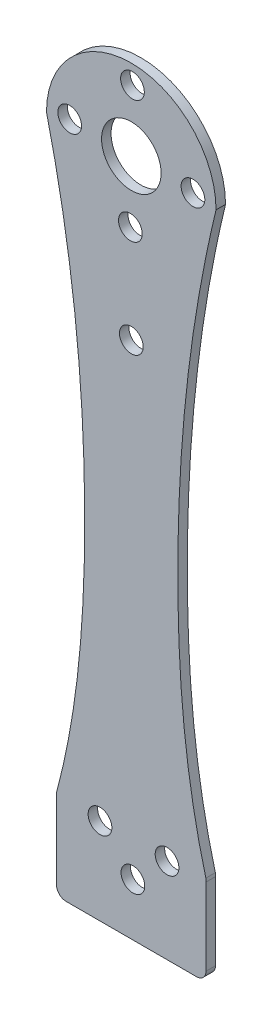
ISO-10303-21;
HEADER;
FILE_DESCRIPTION(('STEP AP214'),'2;1');
FILE_NAME('part.step','',(''),(''),'','','');
FILE_SCHEMA(('AUTOMOTIVE_DESIGN { 1 0 10303 214 1 1 1 1 }'));
ENDSEC;
DATA;
#1=APPLICATION_CONTEXT('core data for automotive mechanical design processes');
#2=APPLICATION_PROTOCOL_DEFINITION('international standard','automotive_design',2000,#1);
#3=PRODUCT_CONTEXT('',#1,'mechanical');
#4=PRODUCT('Part','Part','',(#3));
#5=PRODUCT_RELATED_PRODUCT_CATEGORY('part','',(#4));
#6=PRODUCT_DEFINITION_FORMATION('','',#4);
#7=PRODUCT_DEFINITION_CONTEXT('part definition',#1,'design');
#8=PRODUCT_DEFINITION('design','',#6,#7);
#9=PRODUCT_DEFINITION_SHAPE('','',#8);
#10=(LENGTH_UNIT() NAMED_UNIT(*) SI_UNIT(.MILLI.,.METRE.));
#11=(NAMED_UNIT(*) PLANE_ANGLE_UNIT() SI_UNIT($,.RADIAN.));
#12=(NAMED_UNIT(*) SI_UNIT($,.STERADIAN.) SOLID_ANGLE_UNIT());
#13=UNCERTAINTY_MEASURE_WITH_UNIT(LENGTH_MEASURE(1.E-05),#10,'distance_accuracy_value','');
#14=(GEOMETRIC_REPRESENTATION_CONTEXT(3) GLOBAL_UNCERTAINTY_ASSIGNED_CONTEXT((#13)) GLOBAL_UNIT_ASSIGNED_CONTEXT((#10,
#11,#12)) REPRESENTATION_CONTEXT('',''));
#15=CARTESIAN_POINT('',(0.,0.,0.));
#16=DIRECTION('',(0.,0.,1.));
#17=DIRECTION('',(1.,0.,0.));
#18=AXIS2_PLACEMENT_3D('',#15,#16,#17);
#19=CARTESIAN_POINT('',(-11.3538,84.2645,1.27));
#20=CARTESIAN_POINT('',(-7.71799886799077,69.2244592815278,1.27));
#21=CARTESIAN_POINT('',(-5.0515191185931,42.938826991451,1.27));
#22=CARTESIAN_POINT('',(-7.16781758354668,16.591535459439,1.27));
#23=CARTESIAN_POINT('',(-9.99076973307465,6.0846032391333,1.27));
#24=B_SPLINE_CURVE_WITH_KNOTS('',3,(#19,#20,#21,#22,#23),.UNSPECIFIED.,.F.,.F.,(4,1,4),(0.,
0.587531518822858,1.),.UNSPECIFIED.);
#25=DIRECTION('',(0.,0.,-1.));
#26=VECTOR('',#25,1.);
#27=SURFACE_OF_LINEAR_EXTRUSION('',#24,#26);
#28=CARTESIAN_POINT('',(-11.3538,84.2645,0.));
#29=CARTESIAN_POINT('',(-7.71799886799077,69.2244592815278,0.));
#30=CARTESIAN_POINT('',(-5.0515191185931,42.938826991451,0.));
#31=CARTESIAN_POINT('',(-7.16781758354668,16.591535459439,0.));
#32=CARTESIAN_POINT('',(-9.99076973307465,6.0846032391333,0.));
#33=B_SPLINE_CURVE_WITH_KNOTS('',3,(#28,#29,#30,#31,#32),.UNSPECIFIED.,.F.,.F.,(4,1,4),(0.,
0.587531518822858,1.),.UNSPECIFIED.);
#34=CARTESIAN_POINT('',(-11.3538,84.2645,0.));
#35=VERTEX_POINT('',#34);
#36=CARTESIAN_POINT('',(-9.99076973307465,6.0846032391333,0.));
#37=VERTEX_POINT('',#36);
#38=EDGE_CURVE('E190',#35,#37,#33,.T.);
#39=ORIENTED_EDGE('',*,*,#38,.T.);
#40=DIRECTION('',(0.,0.,-1.));
#41=VECTOR('',#40,1.);
#42=CARTESIAN_POINT('',(-9.99076973307465,6.0846032391333,1.27));
#43=LINE('',#42,#41);
#44=CARTESIAN_POINT('',(-9.99076973307465,6.0846032391333,1.27));
#45=VERTEX_POINT('',#44);
#46=EDGE_CURVE('E11',#45,#37,#43,.T.);
#47=ORIENTED_EDGE('',*,*,#46,.F.);
#48=CARTESIAN_POINT('',(-11.3538,84.2645,1.27));
#49=VERTEX_POINT('',#48);
#50=EDGE_CURVE('E217',#49,#45,#24,.T.);
#51=ORIENTED_EDGE('',*,*,#50,.F.);
#52=DIRECTION('',(0.,0.,-1.));
#53=VECTOR('',#52,1.);
#54=CARTESIAN_POINT('',(-11.3538,84.2645,1.27));
#55=LINE('',#54,#53);
#56=EDGE_CURVE('E138',#49,#35,#55,.T.);
#57=ORIENTED_EDGE('',*,*,#56,.T.);
#58=EDGE_LOOP('',(#39,#47,#51,#57));
#59=FACE_BOUND('',#58,.T.);
#60=ADVANCED_FACE('F33',(#59),#27,.F.);
#61=CARTESIAN_POINT('',(-3.6576,5.622584698307,1.27));
#62=DIRECTION('',(0.,0.,-1.));
#63=DIRECTION('',(-1.,0.,0.));
#64=AXIS2_PLACEMENT_3D('',#61,#62,#63);
#65=CYLINDRICAL_SURFACE('',#64,6.35);
#66=CARTESIAN_POINT('',(-3.6576,5.622584698307,0.));
#67=DIRECTION('',(0.,0.,1.));
#68=DIRECTION('',(1.,0.,0.));
#69=AXIS2_PLACEMENT_3D('',#66,#67,#68);
#70=CIRCLE('',#69,6.35);
#71=CARTESIAN_POINT('',(-10.0076,5.622584698307,0.));
#72=VERTEX_POINT('',#71);
#73=EDGE_CURVE('E181',#37,#72,#70,.T.);
#74=ORIENTED_EDGE('',*,*,#73,.T.);
#75=DIRECTION('',(0.,0.,-1.));
#76=VECTOR('',#75,1.);
#77=CARTESIAN_POINT('',(-10.0076,5.622584698307,1.27));
#78=LINE('',#77,#76);
#79=CARTESIAN_POINT('',(-10.0076,5.622584698307,1.27));
#80=VERTEX_POINT('',#79);
#81=EDGE_CURVE('E42',#80,#72,#78,.T.);
#82=ORIENTED_EDGE('',*,*,#81,.F.);
#83=CARTESIAN_POINT('',(-3.6576,5.622584698307,1.27));
#84=DIRECTION('',(0.,0.,1.));
#85=DIRECTION('',(1.,0.,0.));
#86=AXIS2_PLACEMENT_3D('',#83,#84,#85);
#87=CIRCLE('',#86,6.35);
#88=EDGE_CURVE('E99',#45,#80,#87,.T.);
#89=ORIENTED_EDGE('',*,*,#88,.F.);
#90=ORIENTED_EDGE('',*,*,#46,.T.);
#91=EDGE_LOOP('',(#74,#82,#89,#90));
#92=FACE_BOUND('',#91,.T.);
#93=ADVANCED_FACE('F174',(#92),#65,.T.);
#94=CARTESIAN_POINT('',(-10.0076,5.622584698307,1.27));
#95=DIRECTION('',(1.,0.,0.));
#96=DIRECTION('',(0.,1.,0.));
#97=AXIS2_PLACEMENT_3D('',#94,#95,#96);
#98=PLANE('',#97);
#99=DIRECTION('',(0.,-1.,0.));
#100=VECTOR('',#99,1.);
#101=CARTESIAN_POINT('',(-10.0076,5.622584698307,0.));
#102=LINE('',#101,#100);
#103=CARTESIAN_POINT('',(-10.0076,-4.71169999999999,0.));
#104=VERTEX_POINT('',#103);
#105=EDGE_CURVE('E189',#72,#104,#102,.T.);
#106=ORIENTED_EDGE('',*,*,#105,.T.);
#107=DIRECTION('',(0.,0.,-1.));
#108=VECTOR('',#107,1.);
#109=CARTESIAN_POINT('',(-10.0076,-4.71169999999999,1.27));
#110=LINE('',#109,#108);
#111=CARTESIAN_POINT('',(-10.0076,-4.71169999999999,1.27));
#112=VERTEX_POINT('',#111);
#113=EDGE_CURVE('E195',#112,#104,#110,.T.);
#114=ORIENTED_EDGE('',*,*,#113,.F.);
#115=DIRECTION('',(0.,-1.,0.));
#116=VECTOR('',#115,1.);
#117=CARTESIAN_POINT('',(-10.0076,5.622584698307,1.27));
#118=LINE('',#117,#116);
#119=EDGE_CURVE('E194',#80,#112,#118,.T.);
#120=ORIENTED_EDGE('',*,*,#119,.F.);
#121=ORIENTED_EDGE('',*,*,#81,.T.);
#122=EDGE_LOOP('',(#106,#114,#120,#121));
#123=FACE_BOUND('',#122,.T.);
#124=ADVANCED_FACE('F171',(#123),#98,.F.);
#125=CARTESIAN_POINT('',(-8.7376,-4.7117,1.27));
#126=DIRECTION('',(0.,0.,-1.));
#127=DIRECTION('',(-1.,0.,0.));
#128=AXIS2_PLACEMENT_3D('',#125,#126,#127);
#129=CYLINDRICAL_SURFACE('',#128,1.27);
#130=CARTESIAN_POINT('',(-8.7376,-4.7117,0.));
#131=DIRECTION('',(0.,0.,1.));
#132=DIRECTION('',(1.,0.,0.));
#133=AXIS2_PLACEMENT_3D('',#130,#131,#132);
#134=CIRCLE('',#133,1.27);
#135=CARTESIAN_POINT('',(-8.73759999999999,-5.9817,0.));
#136=VERTEX_POINT('',#135);
#137=EDGE_CURVE('E199',#104,#136,#134,.T.);
#138=ORIENTED_EDGE('',*,*,#137,.T.);
#139=DIRECTION('',(0.,0.,-1.));
#140=VECTOR('',#139,1.);
#141=CARTESIAN_POINT('',(-8.73759999999999,-5.9817,1.27));
#142=LINE('',#141,#140);
#143=CARTESIAN_POINT('',(-8.73759999999999,-5.9817,1.27));
#144=VERTEX_POINT('',#143);
#145=EDGE_CURVE('E227',#144,#136,#142,.T.);
#146=ORIENTED_EDGE('',*,*,#145,.F.);
#147=CARTESIAN_POINT('',(-8.7376,-4.7117,1.27));
#148=DIRECTION('',(0.,0.,1.));
#149=DIRECTION('',(1.,0.,0.));
#150=AXIS2_PLACEMENT_3D('',#147,#148,#149);
#151=CIRCLE('',#150,1.27);
#152=EDGE_CURVE('E232',#112,#144,#151,.T.);
#153=ORIENTED_EDGE('',*,*,#152,.F.);
#154=ORIENTED_EDGE('',*,*,#113,.T.);
#155=EDGE_LOOP('',(#138,#146,#153,#154));
#156=FACE_BOUND('',#155,.T.);
#157=ADVANCED_FACE('F167',(#156),#129,.T.);
#158=CARTESIAN_POINT('',(8.73759999999999,-5.9817,1.27));
#159=DIRECTION('',(0.,1.,0.));
#160=DIRECTION('',(-1.,0.,0.));
#161=AXIS2_PLACEMENT_3D('',#158,#159,#160);
#162=PLANE('',#161);
#163=DIRECTION('',(1.,0.,0.));
#164=VECTOR('',#163,1.);
#165=CARTESIAN_POINT('',(8.73759999999999,-5.9817,0.));
#166=LINE('',#165,#164);
#167=CARTESIAN_POINT('',(8.73759999999999,-5.9817,0.));
#168=VERTEX_POINT('',#167);
#169=EDGE_CURVE('E201',#136,#168,#166,.T.);
#170=ORIENTED_EDGE('',*,*,#169,.T.);
#171=DIRECTION('',(0.,0.,-1.));
#172=VECTOR('',#171,1.);
#173=CARTESIAN_POINT('',(8.73759999999999,-5.9817,1.27));
#174=LINE('',#173,#172);
#175=CARTESIAN_POINT('',(8.73759999999999,-5.9817,1.27));
#176=VERTEX_POINT('',#175);
#177=EDGE_CURVE('E224',#176,#168,#174,.T.);
#178=ORIENTED_EDGE('',*,*,#177,.F.);
#179=DIRECTION('',(1.,0.,0.));
#180=VECTOR('',#179,1.);
#181=CARTESIAN_POINT('',(8.73759999999999,-5.9817,1.27));
#182=LINE('',#181,#180);
#183=EDGE_CURVE('E234',#144,#176,#182,.T.);
#184=ORIENTED_EDGE('',*,*,#183,.F.);
#185=ORIENTED_EDGE('',*,*,#145,.T.);
#186=EDGE_LOOP('',(#170,#178,#184,#185));
#187=FACE_BOUND('',#186,.T.);
#188=ADVANCED_FACE('F163',(#187),#162,.F.);
#189=CARTESIAN_POINT('',(8.7376,-4.7117,1.27));
#190=DIRECTION('',(0.,0.,-1.));
#191=DIRECTION('',(-1.,0.,0.));
#192=AXIS2_PLACEMENT_3D('',#189,#190,#191);
#193=CYLINDRICAL_SURFACE('',#192,1.27);
#194=CARTESIAN_POINT('',(8.7376,-4.7117,0.));
#195=DIRECTION('',(0.,0.,1.));
#196=DIRECTION('',(-1.,0.,0.));
#197=AXIS2_PLACEMENT_3D('',#194,#195,#196);
#198=CIRCLE('',#197,1.27);
#199=CARTESIAN_POINT('',(10.0076,-4.71169999999999,0.));
#200=VERTEX_POINT('',#199);
#201=EDGE_CURVE('E205',#168,#200,#198,.T.);
#202=ORIENTED_EDGE('',*,*,#201,.T.);
#203=DIRECTION('',(0.,0.,-1.));
#204=VECTOR('',#203,1.);
#205=CARTESIAN_POINT('',(10.0076,-4.71169999999999,1.27));
#206=LINE('',#205,#204);
#207=CARTESIAN_POINT('',(10.0076,-4.71169999999999,1.27));
#208=VERTEX_POINT('',#207);
#209=EDGE_CURVE('E221',#208,#200,#206,.T.);
#210=ORIENTED_EDGE('',*,*,#209,.F.);
#211=CARTESIAN_POINT('',(8.7376,-4.7117,1.27));
#212=DIRECTION('',(0.,0.,1.));
#213=DIRECTION('',(-1.,0.,0.));
#214=AXIS2_PLACEMENT_3D('',#211,#212,#213);
#215=CIRCLE('',#214,1.27);
#216=EDGE_CURVE('E236',#176,#208,#215,.T.);
#217=ORIENTED_EDGE('',*,*,#216,.F.);
#218=ORIENTED_EDGE('',*,*,#177,.T.);
#219=EDGE_LOOP('',(#202,#210,#217,#218));
#220=FACE_BOUND('',#219,.T.);
#221=ADVANCED_FACE('F159',(#220),#193,.T.);
#222=CARTESIAN_POINT('',(10.0076,5.62258469830698,1.27));
#223=DIRECTION('',(-1.,0.,0.));
#224=DIRECTION('',(0.,-1.,0.));
#225=AXIS2_PLACEMENT_3D('',#222,#223,#224);
#226=PLANE('',#225);
#227=DIRECTION('',(0.,1.,0.));
#228=VECTOR('',#227,1.);
#229=CARTESIAN_POINT('',(10.0076,5.62258469830698,0.));
#230=LINE('',#229,#228);
#231=CARTESIAN_POINT('',(10.0076,5.62258469830698,0.));
#232=VERTEX_POINT('',#231);
#233=EDGE_CURVE('E207',#200,#232,#230,.T.);
#234=ORIENTED_EDGE('',*,*,#233,.T.);
#235=DIRECTION('',(0.,0.,-1.));
#236=VECTOR('',#235,1.);
#237=CARTESIAN_POINT('',(10.0076,5.62258469830698,1.27));
#238=LINE('',#237,#236);
#239=CARTESIAN_POINT('',(10.0076,5.62258469830698,1.27));
#240=VERTEX_POINT('',#239);
#241=EDGE_CURVE('E133',#240,#232,#238,.T.);
#242=ORIENTED_EDGE('',*,*,#241,.F.);
#243=DIRECTION('',(0.,1.,0.));
#244=VECTOR('',#243,1.);
#245=CARTESIAN_POINT('',(10.0076,5.62258469830698,1.27));
#246=LINE('',#245,#244);
#247=EDGE_CURVE('E124',#208,#240,#246,.T.);
#248=ORIENTED_EDGE('',*,*,#247,.F.);
#249=ORIENTED_EDGE('',*,*,#209,.T.);
#250=EDGE_LOOP('',(#234,#242,#248,#249));
#251=FACE_BOUND('',#250,.T.);
#252=ADVANCED_FACE('F156',(#251),#226,.F.);
#253=CARTESIAN_POINT('',(3.65760000000001,5.62258469830698,1.27));
#254=DIRECTION('',(0.,0.,-1.));
#255=DIRECTION('',(-1.,0.,0.));
#256=AXIS2_PLACEMENT_3D('',#253,#254,#255);
#257=CYLINDRICAL_SURFACE('',#256,6.35);
#258=CARTESIAN_POINT('',(3.65760000000001,5.62258469830698,0.));
#259=DIRECTION('',(0.,0.,1.));
#260=DIRECTION('',(-1.,0.,0.));
#261=AXIS2_PLACEMENT_3D('',#258,#259,#260);
#262=CIRCLE('',#261,6.35);
#263=CARTESIAN_POINT('',(9.99076973307465,6.08460323913331,0.));
#264=VERTEX_POINT('',#263);
#265=EDGE_CURVE('E132',#232,#264,#262,.T.);
#266=ORIENTED_EDGE('',*,*,#265,.T.);
#267=DIRECTION('',(0.,0.,-1.));
#268=VECTOR('',#267,1.);
#269=CARTESIAN_POINT('',(9.99076973307465,6.08460323913331,1.27));
#270=LINE('',#269,#268);
#271=CARTESIAN_POINT('',(9.99076973307465,6.08460323913331,1.27));
#272=VERTEX_POINT('',#271);
#273=EDGE_CURVE('E129',#272,#264,#270,.T.);
#274=ORIENTED_EDGE('',*,*,#273,.F.);
#275=CARTESIAN_POINT('',(3.65760000000001,5.62258469830698,1.27));
#276=DIRECTION('',(0.,0.,1.));
#277=DIRECTION('',(-1.,0.,0.));
#278=AXIS2_PLACEMENT_3D('',#275,#276,#277);
#279=CIRCLE('',#278,6.35);
#280=EDGE_CURVE('E118',#240,#272,#279,.T.);
#281=ORIENTED_EDGE('',*,*,#280,.F.);
#282=ORIENTED_EDGE('',*,*,#241,.T.);
#283=EDGE_LOOP('',(#266,#274,#281,#282));
#284=FACE_BOUND('',#283,.T.);
#285=ADVANCED_FACE('F130',(#284),#257,.T.);
#286=CARTESIAN_POINT('',(9.99076973307465,6.08460323913331,1.27));
#287=CARTESIAN_POINT('',(7.16781758354668,16.591535459439,1.27));
#288=CARTESIAN_POINT('',(5.0515191185931,42.938826991451,1.27));
#289=CARTESIAN_POINT('',(7.71799886799077,69.2244592815278,1.27));
#290=CARTESIAN_POINT('',(11.3538,84.2645,1.27));
#291=B_SPLINE_CURVE_WITH_KNOTS('',3,(#286,#287,#288,#289,#290),.UNSPECIFIED.,.F.,.F.,(4,1,4),
(0.,0.412468481177142,1.),.UNSPECIFIED.);
#292=DIRECTION('',(0.,0.,-1.));
#293=VECTOR('',#292,1.);
#294=SURFACE_OF_LINEAR_EXTRUSION('',#291,#293);
#295=CARTESIAN_POINT('',(9.99076973307465,6.08460323913331,0.));
#296=CARTESIAN_POINT('',(7.16781758354668,16.591535459439,0.));
#297=CARTESIAN_POINT('',(5.0515191185931,42.938826991451,0.));
#298=CARTESIAN_POINT('',(7.71799886799077,69.2244592815278,0.));
#299=CARTESIAN_POINT('',(11.3538,84.2645,0.));
#300=B_SPLINE_CURVE_WITH_KNOTS('',3,(#295,#296,#297,#298,#299),.UNSPECIFIED.,.F.,.F.,(4,1,4),
(0.,0.412468481177142,1.),.UNSPECIFIED.);
#301=CARTESIAN_POINT('',(11.3538,84.2645,0.));
#302=VERTEX_POINT('',#301);
#303=EDGE_CURVE('E85',#264,#302,#300,.T.);
#304=ORIENTED_EDGE('',*,*,#303,.T.);
#305=DIRECTION('',(0.,0.,-1.));
#306=VECTOR('',#305,1.);
#307=CARTESIAN_POINT('',(11.3538,84.2645,1.27));
#308=LINE('',#307,#306);
#309=CARTESIAN_POINT('',(11.3538,84.2645,1.27));
#310=VERTEX_POINT('',#309);
#311=EDGE_CURVE('E134',#310,#302,#308,.T.);
#312=ORIENTED_EDGE('',*,*,#311,.F.);
#313=EDGE_CURVE('E122',#272,#310,#291,.T.);
#314=ORIENTED_EDGE('',*,*,#313,.F.);
#315=ORIENTED_EDGE('',*,*,#273,.T.);
#316=EDGE_LOOP('',(#304,#312,#314,#315));
#317=FACE_BOUND('',#316,.T.);
#318=ADVANCED_FACE('F136',(#317),#294,.F.);
#319=CARTESIAN_POINT('',(0.,84.2645,1.27));
#320=DIRECTION('',(0.,0.,-1.));
#321=DIRECTION('',(-1.,0.,0.));
#322=AXIS2_PLACEMENT_3D('',#319,#320,#321);
#323=CYLINDRICAL_SURFACE('',#322,11.3538);
#324=CARTESIAN_POINT('',(0.,84.2645,0.));
#325=DIRECTION('',(0.,0.,1.));
#326=DIRECTION('',(1.,0.,0.));
#327=AXIS2_PLACEMENT_3D('',#324,#325,#326);
#328=CIRCLE('',#327,11.3538);
#329=EDGE_CURVE('E91',#302,#35,#328,.T.);
#330=ORIENTED_EDGE('',*,*,#329,.T.);
#331=ORIENTED_EDGE('',*,*,#56,.F.);
#332=CARTESIAN_POINT('',(0.,84.2645,1.27));
#333=DIRECTION('',(0.,0.,1.));
#334=DIRECTION('',(1.,0.,0.));
#335=AXIS2_PLACEMENT_3D('',#332,#333,#334);
#336=CIRCLE('',#335,11.3538);
#337=EDGE_CURVE('E50',#310,#49,#336,.T.);
#338=ORIENTED_EDGE('',*,*,#337,.F.);
#339=ORIENTED_EDGE('',*,*,#311,.T.);
#340=EDGE_LOOP('',(#330,#331,#338,#339));
#341=FACE_BOUND('',#340,.T.);
#342=ADVANCED_FACE('F152',(#341),#323,.T.);
#343=CARTESIAN_POINT('',(-6.3093201082903,45.225195436169,1.27));
#344=DIRECTION('',(0.,0.,-1.));
#345=DIRECTION('',(-1.,0.,0.));
#346=AXIS2_PLACEMENT_3D('',#343,#344,#345);
#347=PLANE('',#346);
#348=CARTESIAN_POINT('',(0.160867255410435,93.1164184743224,1.27));
#349=DIRECTION('',(0.,0.,1.));
#350=DIRECTION('',(1.,0.,0.));
#351=AXIS2_PLACEMENT_3D('',#348,#349,#350);
#352=CIRCLE('',#351,1.5875);
#353=CARTESIAN_POINT('',(1.74836725541044,93.1164184743224,1.27));
#354=VERTEX_POINT('',#353);
#355=EDGE_CURVE('E325',#354,#354,#352,.T.);
#356=ORIENTED_EDGE('',*,*,#355,.F.);
#357=EDGE_LOOP('',(#356));
#358=FACE_BOUND('',#357,.T.);
#359=CARTESIAN_POINT('',(0.00953718831058539,84.8241743241323,1.27));
#360=DIRECTION('',(0.,0.,1.));
#361=DIRECTION('',(1.,0.,0.));
#362=AXIS2_PLACEMENT_3D('',#359,#360,#361);
#363=CIRCLE('',#362,3.9878);
#364=CARTESIAN_POINT('',(3.99733718831058,84.8241743241323,1.27));
#365=VERTEX_POINT('',#364);
#366=EDGE_CURVE('E327',#365,#365,#363,.T.);
#367=ORIENTED_EDGE('',*,*,#366,.F.);
#368=EDGE_LOOP('',(#367));
#369=FACE_BOUND('',#368,.T.);
#370=CARTESIAN_POINT('',(-8.24385533372563,84.9870757581271,1.27));
#371=DIRECTION('',(0.,0.,1.));
#372=DIRECTION('',(1.,0.,0.));
#373=AXIS2_PLACEMENT_3D('',#370,#371,#372);
#374=CIRCLE('',#373,1.5875);
#375=CARTESIAN_POINT('',(-6.65635533372563,84.9870757581271,1.27));
#376=VERTEX_POINT('',#375);
#377=EDGE_CURVE('E333',#376,#376,#374,.T.);
#378=ORIENTED_EDGE('',*,*,#377,.F.);
#379=EDGE_LOOP('',(#378));
#380=FACE_BOUND('',#379,.T.);
#381=CARTESIAN_POINT('',(-0.117124746317842,76.5315166928373,1.27));
#382=DIRECTION('',(0.,0.,1.));
#383=DIRECTION('',(1.,0.,0.));
#384=AXIS2_PLACEMENT_3D('',#381,#382,#383);
#385=CIRCLE('',#384,1.5875);
#386=CARTESIAN_POINT('',(1.47037525368216,76.5315166928373,1.27));
#387=VERTEX_POINT('',#386);
#388=EDGE_CURVE('E339',#387,#387,#385,.T.);
#389=ORIENTED_EDGE('',*,*,#388,.F.);
#390=EDGE_LOOP('',(#389));
#391=FACE_BOUND('',#390,.T.);
#392=CARTESIAN_POINT('',(8.26337778543252,84.6858254994141,1.27));
#393=DIRECTION('',(0.,0.,1.));
#394=DIRECTION('',(1.,0.,0.));
#395=AXIS2_PLACEMENT_3D('',#392,#393,#394);
#396=CIRCLE('',#395,1.5875);
#397=CARTESIAN_POINT('',(9.85087778543252,84.6858254994141,1.27));
#398=VERTEX_POINT('',#397);
#399=EDGE_CURVE('E345',#398,#398,#396,.T.);
#400=ORIENTED_EDGE('',*,*,#399,.F.);
#401=EDGE_LOOP('',(#400));
#402=FACE_BOUND('',#401,.T.);
#403=CARTESIAN_POINT('',(0.219579763840228,1.05257599204495,1.27));
#404=DIRECTION('',(0.,0.,1.));
#405=DIRECTION('',(1.,0.,0.));
#406=AXIS2_PLACEMENT_3D('',#403,#404,#405);
#407=CIRCLE('',#406,1.58749999999999);
#408=CARTESIAN_POINT('',(1.80707976384022,1.05257599204495,1.27));
#409=VERTEX_POINT('',#408);
#410=EDGE_CURVE('E351',#409,#409,#407,.T.);
#411=ORIENTED_EDGE('',*,*,#410,.F.);
#412=EDGE_LOOP('',(#411));
#413=FACE_BOUND('',#412,.T.);
#414=CARTESIAN_POINT('',(4.79088965809254,5.46002716599014,1.27));
#415=DIRECTION('',(0.,0.,1.));
#416=DIRECTION('',(1.,0.,0.));
#417=AXIS2_PLACEMENT_3D('',#414,#415,#416);
#418=CIRCLE('',#417,1.58749999999999);
#419=CARTESIAN_POINT('',(6.37838965809254,5.46002716599014,1.27));
#420=VERTEX_POINT('',#419);
#421=EDGE_CURVE('E357',#420,#420,#418,.T.);
#422=ORIENTED_EDGE('',*,*,#421,.F.);
#423=EDGE_LOOP('',(#422));
#424=FACE_BOUND('',#423,.T.);
#425=CARTESIAN_POINT('',(-4.18787141010498,5.62388588629725,1.27));
#426=DIRECTION('',(0.,0.,1.));
#427=DIRECTION('',(1.,0.,0.));
#428=AXIS2_PLACEMENT_3D('',#425,#426,#427);
#429=CIRCLE('',#428,1.5875);
#430=CARTESIAN_POINT('',(-2.60037141010498,5.62388588629725,1.27));
#431=VERTEX_POINT('',#430);
#432=EDGE_CURVE('E261',#431,#431,#429,.T.);
#433=ORIENTED_EDGE('',*,*,#432,.F.);
#434=EDGE_LOOP('',(#433));
#435=FACE_BOUND('',#434,.T.);
#436=CARTESIAN_POINT('',(0.00953718831058544,63.4881743241323,1.27));
#437=DIRECTION('',(0.,0.,1.));
#438=DIRECTION('',(1.,0.,0.));
#439=AXIS2_PLACEMENT_3D('',#436,#437,#438);
#440=CIRCLE('',#439,1.5875);
#441=CARTESIAN_POINT('',(1.59703718831058,63.4881743241323,1.27));
#442=VERTEX_POINT('',#441);
#443=EDGE_CURVE('E248',#442,#442,#440,.T.);
#444=ORIENTED_EDGE('',*,*,#443,.F.);
#445=EDGE_LOOP('',(#444));
#446=FACE_BOUND('',#445,.T.);
#447=ORIENTED_EDGE('',*,*,#50,.T.);
#448=ORIENTED_EDGE('',*,*,#88,.T.);
#449=ORIENTED_EDGE('',*,*,#119,.T.);
#450=ORIENTED_EDGE('',*,*,#152,.T.);
#451=ORIENTED_EDGE('',*,*,#183,.T.);
#452=ORIENTED_EDGE('',*,*,#216,.T.);
#453=ORIENTED_EDGE('',*,*,#247,.T.);
#454=ORIENTED_EDGE('',*,*,#280,.T.);
#455=ORIENTED_EDGE('',*,*,#313,.T.);
#456=ORIENTED_EDGE('',*,*,#337,.T.);
#457=EDGE_LOOP('',(#447,#448,#449,#450,#451,#452,#453,#454,#455,#456));
#458=FACE_BOUND('',#457,.T.);
#459=ADVANCED_FACE('F120',(#358,#369,#380,#391,#402,#413,#424,#435,#446,#458),#347,.F.);
#460=CARTESIAN_POINT('',(-6.3093201082903,45.225195436169,0.));
#461=DIRECTION('',(0.,0.,-1.));
#462=DIRECTION('',(-1.,0.,0.));
#463=AXIS2_PLACEMENT_3D('',#460,#461,#462);
#464=PLANE('',#463);
#465=CARTESIAN_POINT('',(0.160867255410435,93.1164184743224,0.));
#466=DIRECTION('',(0.,0.,1.));
#467=DIRECTION('',(1.,0.,0.));
#468=AXIS2_PLACEMENT_3D('',#465,#466,#467);
#469=CIRCLE('',#468,1.5875);
#470=CARTESIAN_POINT('',(1.74836725541044,93.1164184743224,0.));
#471=VERTEX_POINT('',#470);
#472=EDGE_CURVE('E323',#471,#471,#469,.T.);
#473=ORIENTED_EDGE('',*,*,#472,.T.);
#474=EDGE_LOOP('',(#473));
#475=FACE_BOUND('',#474,.T.);
#476=CARTESIAN_POINT('',(0.00953718831058539,84.8241743241323,0.));
#477=DIRECTION('',(0.,0.,1.));
#478=DIRECTION('',(1.,0.,0.));
#479=AXIS2_PLACEMENT_3D('',#476,#477,#478);
#480=CIRCLE('',#479,3.9878);
#481=CARTESIAN_POINT('',(3.99733718831058,84.8241743241323,0.));
#482=VERTEX_POINT('',#481);
#483=EDGE_CURVE('E330',#482,#482,#480,.T.);
#484=ORIENTED_EDGE('',*,*,#483,.T.);
#485=EDGE_LOOP('',(#484));
#486=FACE_BOUND('',#485,.T.);
#487=CARTESIAN_POINT('',(-8.24385533372563,84.9870757581271,0.));
#488=DIRECTION('',(0.,0.,1.));
#489=DIRECTION('',(1.,0.,0.));
#490=AXIS2_PLACEMENT_3D('',#487,#488,#489);
#491=CIRCLE('',#490,1.5875);
#492=CARTESIAN_POINT('',(-6.65635533372563,84.9870757581271,0.));
#493=VERTEX_POINT('',#492);
#494=EDGE_CURVE('E336',#493,#493,#491,.T.);
#495=ORIENTED_EDGE('',*,*,#494,.T.);
#496=EDGE_LOOP('',(#495));
#497=FACE_BOUND('',#496,.T.);
#498=CARTESIAN_POINT('',(-0.117124746317842,76.5315166928373,0.));
#499=DIRECTION('',(0.,0.,1.));
#500=DIRECTION('',(1.,0.,0.));
#501=AXIS2_PLACEMENT_3D('',#498,#499,#500);
#502=CIRCLE('',#501,1.5875);
#503=CARTESIAN_POINT('',(1.47037525368216,76.5315166928373,0.));
#504=VERTEX_POINT('',#503);
#505=EDGE_CURVE('E342',#504,#504,#502,.T.);
#506=ORIENTED_EDGE('',*,*,#505,.T.);
#507=EDGE_LOOP('',(#506));
#508=FACE_BOUND('',#507,.T.);
#509=CARTESIAN_POINT('',(8.26337778543252,84.6858254994141,0.));
#510=DIRECTION('',(0.,0.,1.));
#511=DIRECTION('',(1.,0.,0.));
#512=AXIS2_PLACEMENT_3D('',#509,#510,#511);
#513=CIRCLE('',#512,1.5875);
#514=CARTESIAN_POINT('',(9.85087778543252,84.6858254994141,0.));
#515=VERTEX_POINT('',#514);
#516=EDGE_CURVE('E348',#515,#515,#513,.T.);
#517=ORIENTED_EDGE('',*,*,#516,.T.);
#518=EDGE_LOOP('',(#517));
#519=FACE_BOUND('',#518,.T.);
#520=CARTESIAN_POINT('',(0.219579763840228,1.05257599204495,0.));
#521=DIRECTION('',(0.,0.,1.));
#522=DIRECTION('',(1.,0.,0.));
#523=AXIS2_PLACEMENT_3D('',#520,#521,#522);
#524=CIRCLE('',#523,1.58749999999999);
#525=CARTESIAN_POINT('',(1.80707976384022,1.05257599204495,0.));
#526=VERTEX_POINT('',#525);
#527=EDGE_CURVE('E354',#526,#526,#524,.T.);
#528=ORIENTED_EDGE('',*,*,#527,.T.);
#529=EDGE_LOOP('',(#528));
#530=FACE_BOUND('',#529,.T.);
#531=CARTESIAN_POINT('',(4.79088965809254,5.46002716599014,0.));
#532=DIRECTION('',(0.,0.,1.));
#533=DIRECTION('',(1.,0.,0.));
#534=AXIS2_PLACEMENT_3D('',#531,#532,#533);
#535=CIRCLE('',#534,1.58749999999999);
#536=CARTESIAN_POINT('',(6.37838965809254,5.46002716599014,0.));
#537=VERTEX_POINT('',#536);
#538=EDGE_CURVE('E360',#537,#537,#535,.T.);
#539=ORIENTED_EDGE('',*,*,#538,.T.);
#540=EDGE_LOOP('',(#539));
#541=FACE_BOUND('',#540,.T.);
#542=CARTESIAN_POINT('',(-4.18787141010498,5.62388588629725,0.));
#543=DIRECTION('',(0.,0.,1.));
#544=DIRECTION('',(1.,0.,0.));
#545=AXIS2_PLACEMENT_3D('',#542,#543,#544);
#546=CIRCLE('',#545,1.5875);
#547=CARTESIAN_POINT('',(-2.60037141010498,5.62388588629725,0.));
#548=VERTEX_POINT('',#547);
#549=EDGE_CURVE('E258',#548,#548,#546,.T.);
#550=ORIENTED_EDGE('',*,*,#549,.T.);
#551=EDGE_LOOP('',(#550));
#552=FACE_BOUND('',#551,.T.);
#553=CARTESIAN_POINT('',(0.00953718831058544,63.4881743241323,0.));
#554=DIRECTION('',(0.,0.,1.));
#555=DIRECTION('',(1.,0.,0.));
#556=AXIS2_PLACEMENT_3D('',#553,#554,#555);
#557=CIRCLE('',#556,1.5875);
#558=CARTESIAN_POINT('',(1.59703718831058,63.4881743241323,0.));
#559=VERTEX_POINT('',#558);
#560=EDGE_CURVE('E246',#559,#559,#557,.T.);
#561=ORIENTED_EDGE('',*,*,#560,.T.);
#562=EDGE_LOOP('',(#561));
#563=FACE_BOUND('',#562,.T.);
#564=ORIENTED_EDGE('',*,*,#38,.F.);
#565=ORIENTED_EDGE('',*,*,#329,.F.);
#566=ORIENTED_EDGE('',*,*,#303,.F.);
#567=ORIENTED_EDGE('',*,*,#265,.F.);
#568=ORIENTED_EDGE('',*,*,#233,.F.);
#569=ORIENTED_EDGE('',*,*,#201,.F.);
#570=ORIENTED_EDGE('',*,*,#169,.F.);
#571=ORIENTED_EDGE('',*,*,#137,.F.);
#572=ORIENTED_EDGE('',*,*,#105,.F.);
#573=ORIENTED_EDGE('',*,*,#73,.F.);
#574=EDGE_LOOP('',(#564,#565,#566,#567,#568,#569,#570,#571,#572,#573));
#575=FACE_BOUND('',#574,.T.);
#576=ADVANCED_FACE('F197',(#475,#486,#497,#508,#519,#530,#541,#552,#563,#575),#464,.T.);
#577=CARTESIAN_POINT('',(0.00953718831058544,63.4881743241323,0.));
#578=DIRECTION('',(0.,0.,1.));
#579=DIRECTION('',(1.,0.,0.));
#580=AXIS2_PLACEMENT_3D('',#577,#578,#579);
#581=CYLINDRICAL_SURFACE('',#580,1.5875);
#582=ORIENTED_EDGE('',*,*,#560,.F.);
#583=EDGE_LOOP('',(#582));
#584=FACE_BOUND('',#583,.T.);
#585=ORIENTED_EDGE('',*,*,#443,.T.);
#586=EDGE_LOOP('',(#585));
#587=FACE_BOUND('',#586,.T.);
#588=ADVANCED_FACE('F279',(#584,#587),#581,.F.);
#589=CARTESIAN_POINT('',(-4.18787141010498,5.62388588629725,0.));
#590=DIRECTION('',(0.,0.,1.));
#591=DIRECTION('',(1.,0.,0.));
#592=AXIS2_PLACEMENT_3D('',#589,#590,#591);
#593=CYLINDRICAL_SURFACE('',#592,1.5875);
#594=ORIENTED_EDGE('',*,*,#549,.F.);
#595=EDGE_LOOP('',(#594));
#596=FACE_BOUND('',#595,.T.);
#597=ORIENTED_EDGE('',*,*,#432,.T.);
#598=EDGE_LOOP('',(#597));
#599=FACE_BOUND('',#598,.T.);
#600=ADVANCED_FACE('F286',(#596,#599),#593,.F.);
#601=CARTESIAN_POINT('',(4.79088965809254,5.46002716599014,0.));
#602=DIRECTION('',(0.,0.,1.));
#603=DIRECTION('',(1.,0.,0.));
#604=AXIS2_PLACEMENT_3D('',#601,#602,#603);
#605=CYLINDRICAL_SURFACE('',#604,1.58749999999999);
#606=ORIENTED_EDGE('',*,*,#538,.F.);
#607=EDGE_LOOP('',(#606));
#608=FACE_BOUND('',#607,.T.);
#609=ORIENTED_EDGE('',*,*,#421,.T.);
#610=EDGE_LOOP('',(#609));
#611=FACE_BOUND('',#610,.T.);
#612=ADVANCED_FACE('F290',(#608,#611),#605,.F.);
#613=CARTESIAN_POINT('',(0.219579763840228,1.05257599204495,0.));
#614=DIRECTION('',(0.,0.,1.));
#615=DIRECTION('',(1.,0.,0.));
#616=AXIS2_PLACEMENT_3D('',#613,#614,#615);
#617=CYLINDRICAL_SURFACE('',#616,1.58749999999999);
#618=ORIENTED_EDGE('',*,*,#527,.F.);
#619=EDGE_LOOP('',(#618));
#620=FACE_BOUND('',#619,.T.);
#621=ORIENTED_EDGE('',*,*,#410,.T.);
#622=EDGE_LOOP('',(#621));
#623=FACE_BOUND('',#622,.T.);
#624=ADVANCED_FACE('F294',(#620,#623),#617,.F.);
#625=CARTESIAN_POINT('',(8.26337778543252,84.6858254994141,0.));
#626=DIRECTION('',(0.,0.,1.));
#627=DIRECTION('',(1.,0.,0.));
#628=AXIS2_PLACEMENT_3D('',#625,#626,#627);
#629=CYLINDRICAL_SURFACE('',#628,1.5875);
#630=ORIENTED_EDGE('',*,*,#516,.F.);
#631=EDGE_LOOP('',(#630));
#632=FACE_BOUND('',#631,.T.);
#633=ORIENTED_EDGE('',*,*,#399,.T.);
#634=EDGE_LOOP('',(#633));
#635=FACE_BOUND('',#634,.T.);
#636=ADVANCED_FACE('F298',(#632,#635),#629,.F.);
#637=CARTESIAN_POINT('',(-0.117124746317842,76.5315166928373,0.));
#638=DIRECTION('',(0.,0.,1.));
#639=DIRECTION('',(1.,0.,0.));
#640=AXIS2_PLACEMENT_3D('',#637,#638,#639);
#641=CYLINDRICAL_SURFACE('',#640,1.5875);
#642=ORIENTED_EDGE('',*,*,#505,.F.);
#643=EDGE_LOOP('',(#642));
#644=FACE_BOUND('',#643,.T.);
#645=ORIENTED_EDGE('',*,*,#388,.T.);
#646=EDGE_LOOP('',(#645));
#647=FACE_BOUND('',#646,.T.);
#648=ADVANCED_FACE('F302',(#644,#647),#641,.F.);
#649=CARTESIAN_POINT('',(-8.24385533372563,84.9870757581271,0.));
#650=DIRECTION('',(0.,0.,1.));
#651=DIRECTION('',(1.,0.,0.));
#652=AXIS2_PLACEMENT_3D('',#649,#650,#651);
#653=CYLINDRICAL_SURFACE('',#652,1.5875);
#654=ORIENTED_EDGE('',*,*,#494,.F.);
#655=EDGE_LOOP('',(#654));
#656=FACE_BOUND('',#655,.T.);
#657=ORIENTED_EDGE('',*,*,#377,.T.);
#658=EDGE_LOOP('',(#657));
#659=FACE_BOUND('',#658,.T.);
#660=ADVANCED_FACE('F306',(#656,#659),#653,.F.);
#661=CARTESIAN_POINT('',(0.00953718831058539,84.8241743241323,0.));
#662=DIRECTION('',(0.,0.,1.));
#663=DIRECTION('',(1.,0.,0.));
#664=AXIS2_PLACEMENT_3D('',#661,#662,#663);
#665=CYLINDRICAL_SURFACE('',#664,3.9878);
#666=ORIENTED_EDGE('',*,*,#483,.F.);
#667=EDGE_LOOP('',(#666));
#668=FACE_BOUND('',#667,.T.);
#669=ORIENTED_EDGE('',*,*,#366,.T.);
#670=EDGE_LOOP('',(#669));
#671=FACE_BOUND('',#670,.T.);
#672=ADVANCED_FACE('F310',(#668,#671),#665,.F.);
#673=CARTESIAN_POINT('',(0.160867255410435,93.1164184743224,0.));
#674=DIRECTION('',(0.,0.,1.));
#675=DIRECTION('',(1.,0.,0.));
#676=AXIS2_PLACEMENT_3D('',#673,#674,#675);
#677=CYLINDRICAL_SURFACE('',#676,1.5875);
#678=ORIENTED_EDGE('',*,*,#472,.F.);
#679=EDGE_LOOP('',(#678));
#680=FACE_BOUND('',#679,.T.);
#681=ORIENTED_EDGE('',*,*,#355,.T.);
#682=EDGE_LOOP('',(#681));
#683=FACE_BOUND('',#682,.T.);
#684=ADVANCED_FACE('F314',(#680,#683),#677,.F.);
#685=CLOSED_SHELL('',(#60,#93,#124,#157,#188,#221,#252,#285,#318,#342,#459,#576,#588,#600,#612,
#624,#636,#648,#660,#672,#684));
#686=MANIFOLD_SOLID_BREP('B2',#685);
#687=ADVANCED_BREP_SHAPE_REPRESENTATION('',(#18,#686),#14);
#688=SHAPE_DEFINITION_REPRESENTATION(#9,#687);
ENDSEC;
END-ISO-10303-21;
